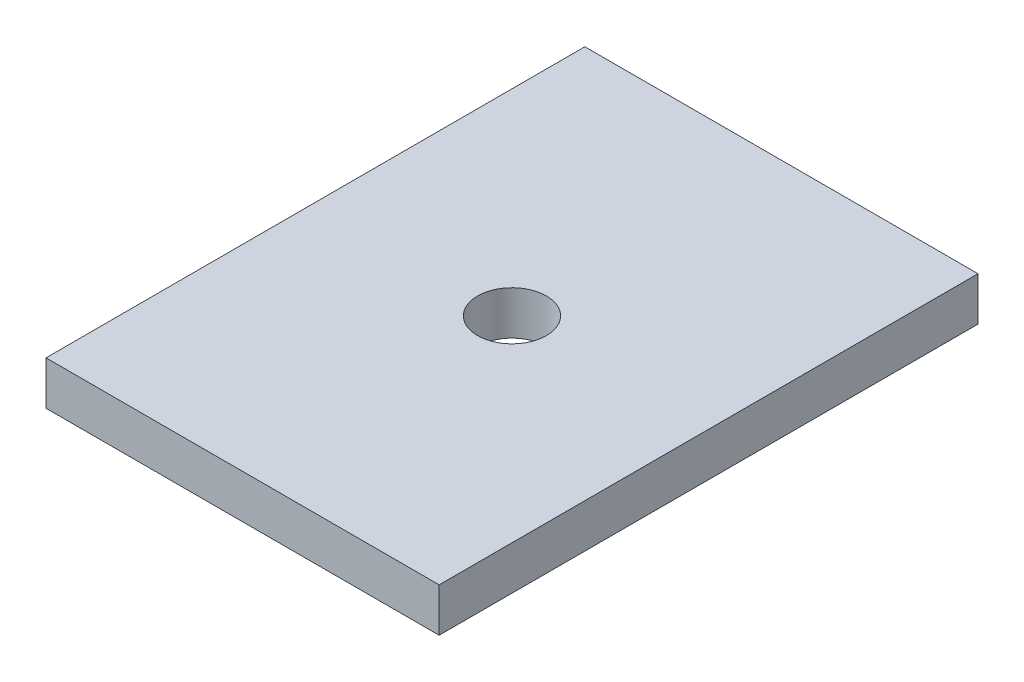
ISO-10303-21;
HEADER;
FILE_DESCRIPTION(('STEP AP214'),'2;1');
FILE_NAME('part.step','',(''),(''),'','','');
FILE_SCHEMA(('AUTOMOTIVE_DESIGN { 1 0 10303 214 1 1 1 1 }'));
ENDSEC;
DATA;
#1=APPLICATION_CONTEXT('core data for automotive mechanical design processes');
#2=APPLICATION_PROTOCOL_DEFINITION('international standard','automotive_design',2000,#1);
#3=PRODUCT_CONTEXT('',#1,'mechanical');
#4=PRODUCT('Part','Part','',(#3));
#5=PRODUCT_RELATED_PRODUCT_CATEGORY('part','',(#4));
#6=PRODUCT_DEFINITION_FORMATION('','',#4);
#7=PRODUCT_DEFINITION_CONTEXT('part definition',#1,'design');
#8=PRODUCT_DEFINITION('design','',#6,#7);
#9=PRODUCT_DEFINITION_SHAPE('','',#8);
#10=(LENGTH_UNIT() NAMED_UNIT(*) SI_UNIT(.MILLI.,.METRE.));
#11=(NAMED_UNIT(*) PLANE_ANGLE_UNIT() SI_UNIT($,.RADIAN.));
#12=(NAMED_UNIT(*) SI_UNIT($,.STERADIAN.) SOLID_ANGLE_UNIT());
#13=UNCERTAINTY_MEASURE_WITH_UNIT(LENGTH_MEASURE(1.E-05),#10,'distance_accuracy_value','');
#14=(GEOMETRIC_REPRESENTATION_CONTEXT(3) GLOBAL_UNCERTAINTY_ASSIGNED_CONTEXT((#13)) GLOBAL_UNIT_ASSIGNED_CONTEXT((#10,
#11,#12)) REPRESENTATION_CONTEXT('',''));
#15=CARTESIAN_POINT('',(0.,0.,0.));
#16=DIRECTION('',(0.,0.,1.));
#17=DIRECTION('',(1.,0.,0.));
#18=AXIS2_PLACEMENT_3D('',#15,#16,#17);
#19=CARTESIAN_POINT('',(0.,19.05,0.));
#20=DIRECTION('',(0.,-1.,0.));
#21=DIRECTION('',(0.,0.,-1.));
#22=AXIS2_PLACEMENT_3D('',#19,#20,#21);
#23=PLANE('',#22);
#24=DIRECTION('',(0.,0.,-1.));
#25=VECTOR('',#24,1.);
#26=CARTESIAN_POINT('',(85.725,19.05,117.5));
#27=LINE('',#26,#25);
#28=CARTESIAN_POINT('',(85.725,19.05,117.5));
#29=VERTEX_POINT('',#28);
#30=CARTESIAN_POINT('',(85.725,19.05,-117.5));
#31=VERTEX_POINT('',#30);
#32=EDGE_CURVE('E86',#29,#31,#27,.T.);
#33=ORIENTED_EDGE('',*,*,#32,.T.);
#34=DIRECTION('',(-1.,0.,0.));
#35=VECTOR('',#34,1.);
#36=CARTESIAN_POINT('',(-85.725,19.05,-117.5));
#37=LINE('',#36,#35);
#38=CARTESIAN_POINT('',(-85.725,19.05,-117.5));
#39=VERTEX_POINT('',#38);
#40=EDGE_CURVE('E81',#31,#39,#37,.T.);
#41=ORIENTED_EDGE('',*,*,#40,.T.);
#42=DIRECTION('',(0.,0.,1.));
#43=VECTOR('',#42,1.);
#44=CARTESIAN_POINT('',(-85.725,19.05,117.5));
#45=LINE('',#44,#43);
#46=CARTESIAN_POINT('',(-85.725,19.05,117.5));
#47=VERTEX_POINT('',#46);
#48=EDGE_CURVE('E84',#39,#47,#45,.T.);
#49=ORIENTED_EDGE('',*,*,#48,.T.);
#50=DIRECTION('',(1.,0.,0.));
#51=VECTOR('',#50,1.);
#52=CARTESIAN_POINT('',(-85.725,19.05,117.5));
#53=LINE('',#52,#51);
#54=EDGE_CURVE('E51',#47,#29,#53,.T.);
#55=ORIENTED_EDGE('',*,*,#54,.T.);
#56=EDGE_LOOP('',(#33,#41,#49,#55));
#57=FACE_BOUND('',#56,.T.);
#58=CARTESIAN_POINT('',(0.,19.05,0.));
#59=DIRECTION('',(0.,1.,0.));
#60=DIRECTION('',(0.,0.,1.));
#61=AXIS2_PLACEMENT_3D('',#58,#59,#60);
#62=CIRCLE('',#61,15.);
#63=CARTESIAN_POINT('',(0.,19.05,-15.));
#64=VERTEX_POINT('',#63);
#65=EDGE_CURVE('E101',#64,#64,#62,.T.);
#66=ORIENTED_EDGE('',*,*,#65,.F.);
#67=EDGE_LOOP('',(#66));
#68=FACE_BOUND('',#67,.T.);
#69=ADVANCED_FACE('F34',(#57,#68),#23,.F.);
#70=CARTESIAN_POINT('',(0.,0.,0.));
#71=DIRECTION('',(0.,-1.,0.));
#72=DIRECTION('',(0.,0.,-1.));
#73=AXIS2_PLACEMENT_3D('',#70,#71,#72);
#74=PLANE('',#73);
#75=DIRECTION('',(0.,0.,-1.));
#76=VECTOR('',#75,1.);
#77=CARTESIAN_POINT('',(85.725,0.,117.5));
#78=LINE('',#77,#76);
#79=CARTESIAN_POINT('',(85.725,0.,117.5));
#80=VERTEX_POINT('',#79);
#81=CARTESIAN_POINT('',(85.725,0.,-117.5));
#82=VERTEX_POINT('',#81);
#83=EDGE_CURVE('E98',#80,#82,#78,.T.);
#84=ORIENTED_EDGE('',*,*,#83,.F.);
#85=DIRECTION('',(1.,0.,0.));
#86=VECTOR('',#85,1.);
#87=CARTESIAN_POINT('',(-85.725,0.,117.5));
#88=LINE('',#87,#86);
#89=CARTESIAN_POINT('',(-85.725,0.,117.5));
#90=VERTEX_POINT('',#89);
#91=EDGE_CURVE('E74',#90,#80,#88,.T.);
#92=ORIENTED_EDGE('',*,*,#91,.F.);
#93=DIRECTION('',(0.,0.,1.));
#94=VECTOR('',#93,1.);
#95=CARTESIAN_POINT('',(-85.725,0.,117.5));
#96=LINE('',#95,#94);
#97=CARTESIAN_POINT('',(-85.725,0.,-117.5));
#98=VERTEX_POINT('',#97);
#99=EDGE_CURVE('E68',#98,#90,#96,.T.);
#100=ORIENTED_EDGE('',*,*,#99,.F.);
#101=DIRECTION('',(-1.,0.,0.));
#102=VECTOR('',#101,1.);
#103=CARTESIAN_POINT('',(-85.725,0.,-117.5));
#104=LINE('',#103,#102);
#105=EDGE_CURVE('E90',#82,#98,#104,.T.);
#106=ORIENTED_EDGE('',*,*,#105,.F.);
#107=EDGE_LOOP('',(#84,#92,#100,#106));
#108=FACE_BOUND('',#107,.T.);
#109=CARTESIAN_POINT('',(0.,0.,0.));
#110=DIRECTION('',(0.,1.,0.));
#111=DIRECTION('',(0.,0.,1.));
#112=AXIS2_PLACEMENT_3D('',#109,#110,#111);
#113=CIRCLE('',#112,15.);
#114=CARTESIAN_POINT('',(0.,0.,-15.));
#115=VERTEX_POINT('',#114);
#116=EDGE_CURVE('E113',#115,#115,#113,.T.);
#117=ORIENTED_EDGE('',*,*,#116,.T.);
#118=EDGE_LOOP('',(#117));
#119=FACE_BOUND('',#118,.T.);
#120=ADVANCED_FACE('F109',(#108,#119),#74,.T.);
#121=CARTESIAN_POINT('',(85.725,19.05,117.5));
#122=DIRECTION('',(-1.,0.,0.));
#123=DIRECTION('',(0.,0.,1.));
#124=AXIS2_PLACEMENT_3D('',#121,#122,#123);
#125=PLANE('',#124);
#126=ORIENTED_EDGE('',*,*,#83,.T.);
#127=DIRECTION('',(0.,-1.,0.));
#128=VECTOR('',#127,1.);
#129=CARTESIAN_POINT('',(85.725,19.05,-117.5));
#130=LINE('',#129,#128);
#131=EDGE_CURVE('E11',#31,#82,#130,.T.);
#132=ORIENTED_EDGE('',*,*,#131,.F.);
#133=ORIENTED_EDGE('',*,*,#32,.F.);
#134=DIRECTION('',(0.,-1.,0.));
#135=VECTOR('',#134,1.);
#136=CARTESIAN_POINT('',(85.725,19.05,117.5));
#137=LINE('',#136,#135);
#138=EDGE_CURVE('E94',#29,#80,#137,.T.);
#139=ORIENTED_EDGE('',*,*,#138,.T.);
#140=EDGE_LOOP('',(#126,#132,#133,#139));
#141=FACE_BOUND('',#140,.T.);
#142=ADVANCED_FACE('F36',(#141),#125,.F.);
#143=CARTESIAN_POINT('',(-85.725,19.05,-117.5));
#144=DIRECTION('',(0.,0.,1.));
#145=DIRECTION('',(1.,0.,0.));
#146=AXIS2_PLACEMENT_3D('',#143,#144,#145);
#147=PLANE('',#146);
#148=ORIENTED_EDGE('',*,*,#105,.T.);
#149=DIRECTION('',(0.,-1.,0.));
#150=VECTOR('',#149,1.);
#151=CARTESIAN_POINT('',(-85.725,19.05,-117.5));
#152=LINE('',#151,#150);
#153=EDGE_CURVE('E43',#39,#98,#152,.T.);
#154=ORIENTED_EDGE('',*,*,#153,.F.);
#155=ORIENTED_EDGE('',*,*,#40,.F.);
#156=ORIENTED_EDGE('',*,*,#131,.T.);
#157=EDGE_LOOP('',(#148,#154,#155,#156));
#158=FACE_BOUND('',#157,.T.);
#159=ADVANCED_FACE('F89',(#158),#147,.F.);
#160=CARTESIAN_POINT('',(-85.725,19.05,117.5));
#161=DIRECTION('',(1.,0.,0.));
#162=DIRECTION('',(0.,0.,-1.));
#163=AXIS2_PLACEMENT_3D('',#160,#161,#162);
#164=PLANE('',#163);
#165=ORIENTED_EDGE('',*,*,#99,.T.);
#166=DIRECTION('',(0.,-1.,0.));
#167=VECTOR('',#166,1.);
#168=CARTESIAN_POINT('',(-85.725,19.05,117.5));
#169=LINE('',#168,#167);
#170=EDGE_CURVE('E91',#47,#90,#169,.T.);
#171=ORIENTED_EDGE('',*,*,#170,.F.);
#172=ORIENTED_EDGE('',*,*,#48,.F.);
#173=ORIENTED_EDGE('',*,*,#153,.T.);
#174=EDGE_LOOP('',(#165,#171,#172,#173));
#175=FACE_BOUND('',#174,.T.);
#176=ADVANCED_FACE('F92',(#175),#164,.F.);
#177=CARTESIAN_POINT('',(-85.725,19.05,117.5));
#178=DIRECTION('',(0.,0.,-1.));
#179=DIRECTION('',(-1.,0.,0.));
#180=AXIS2_PLACEMENT_3D('',#177,#178,#179);
#181=PLANE('',#180);
#182=ORIENTED_EDGE('',*,*,#91,.T.);
#183=ORIENTED_EDGE('',*,*,#138,.F.);
#184=ORIENTED_EDGE('',*,*,#54,.F.);
#185=ORIENTED_EDGE('',*,*,#170,.T.);
#186=EDGE_LOOP('',(#182,#183,#184,#185));
#187=FACE_BOUND('',#186,.T.);
#188=ADVANCED_FACE('F106',(#187),#181,.F.);
#189=CARTESIAN_POINT('',(0.,19.05,0.));
#190=DIRECTION('',(0.,-1.,0.));
#191=DIRECTION('',(0.,0.,-1.));
#192=AXIS2_PLACEMENT_3D('',#189,#190,#191);
#193=CYLINDRICAL_SURFACE('',#192,15.);
#194=CARTESIAN_POINT('',(0.,19.05,-15.));
#195=CARTESIAN_POINT('',(0.,18.8515625,-15.));
#196=CARTESIAN_POINT('',(0.,18.653125,-15.));
#197=CARTESIAN_POINT('',(0.,18.25625,-15.));
#198=CARTESIAN_POINT('',(0.,18.0578125,-15.));
#199=CARTESIAN_POINT('',(0.,17.6609375,-15.));
#200=CARTESIAN_POINT('',(0.,17.4625,-15.));
#201=CARTESIAN_POINT('',(0.,17.065625,-15.));
#202=CARTESIAN_POINT('',(0.,16.8671875,-15.));
#203=CARTESIAN_POINT('',(0.,16.4703125,-15.));
#204=CARTESIAN_POINT('',(0.,16.271875,-15.));
#205=CARTESIAN_POINT('',(0.,15.875,-15.));
#206=CARTESIAN_POINT('',(0.,15.6765625,-15.));
#207=CARTESIAN_POINT('',(0.,15.2796875,-15.));
#208=CARTESIAN_POINT('',(0.,15.08125,-15.));
#209=CARTESIAN_POINT('',(0.,14.684375,-15.));
#210=CARTESIAN_POINT('',(0.,14.4859375,-15.));
#211=CARTESIAN_POINT('',(0.,14.0890625,-15.));
#212=CARTESIAN_POINT('',(0.,13.890625,-15.));
#213=CARTESIAN_POINT('',(0.,13.49375,-15.));
#214=CARTESIAN_POINT('',(0.,13.2953125,-15.));
#215=CARTESIAN_POINT('',(0.,12.8984375,-15.));
#216=CARTESIAN_POINT('',(0.,12.7,-15.));
#217=CARTESIAN_POINT('',(0.,12.303125,-15.));
#218=CARTESIAN_POINT('',(0.,12.1046875,-15.));
#219=CARTESIAN_POINT('',(0.,11.7078125,-15.));
#220=CARTESIAN_POINT('',(0.,11.509375,-15.));
#221=CARTESIAN_POINT('',(0.,11.1125,-15.));
#222=CARTESIAN_POINT('',(0.,10.9140625,-15.));
#223=CARTESIAN_POINT('',(0.,10.5171875,-15.));
#224=CARTESIAN_POINT('',(0.,10.31875,-15.));
#225=CARTESIAN_POINT('',(0.,9.921875,-15.));
#226=CARTESIAN_POINT('',(0.,9.7234375,-15.));
#227=CARTESIAN_POINT('',(0.,9.3265625,-15.));
#228=CARTESIAN_POINT('',(0.,9.128125,-15.));
#229=CARTESIAN_POINT('',(0.,8.73125,-15.));
#230=CARTESIAN_POINT('',(0.,8.5328125,-15.));
#231=CARTESIAN_POINT('',(0.,8.1359375,-15.));
#232=CARTESIAN_POINT('',(0.,7.9375,-15.));
#233=CARTESIAN_POINT('',(0.,7.540625,-15.));
#234=CARTESIAN_POINT('',(0.,7.3421875,-15.));
#235=CARTESIAN_POINT('',(0.,6.9453125,-15.));
#236=CARTESIAN_POINT('',(0.,6.746875,-15.));
#237=CARTESIAN_POINT('',(0.,6.35,-15.));
#238=CARTESIAN_POINT('',(0.,6.1515625,-15.));
#239=CARTESIAN_POINT('',(0.,5.7546875,-15.));
#240=CARTESIAN_POINT('',(0.,5.55625,-15.));
#241=CARTESIAN_POINT('',(0.,5.159375,-15.));
#242=CARTESIAN_POINT('',(0.,4.9609375,-15.));
#243=CARTESIAN_POINT('',(0.,4.5640625,-15.));
#244=CARTESIAN_POINT('',(0.,4.365625,-15.));
#245=CARTESIAN_POINT('',(0.,3.96875,-15.));
#246=CARTESIAN_POINT('',(0.,3.7703125,-15.));
#247=CARTESIAN_POINT('',(0.,3.3734375,-15.));
#248=CARTESIAN_POINT('',(0.,3.175,-15.));
#249=CARTESIAN_POINT('',(0.,2.778125,-15.));
#250=CARTESIAN_POINT('',(0.,2.5796875,-15.));
#251=CARTESIAN_POINT('',(0.,2.1828125,-15.));
#252=CARTESIAN_POINT('',(0.,1.984375,-15.));
#253=CARTESIAN_POINT('',(0.,1.5875,-15.));
#254=CARTESIAN_POINT('',(0.,1.3890625,-15.));
#255=CARTESIAN_POINT('',(0.,0.992187500000001,-15.));
#256=CARTESIAN_POINT('',(0.,0.793750000000001,-15.));
#257=CARTESIAN_POINT('',(0.,0.396875,-15.));
#258=CARTESIAN_POINT('',(0.,0.1984375,-15.));
#259=CARTESIAN_POINT('',(0.,0.,-15.));
#260=B_SPLINE_CURVE_WITH_KNOTS('',3,(#194,#195,#196,#197,#198,#199,#200,#201,#202,#203,#204,
#205,#206,#207,#208,#209,#210,#211,#212,#213,#214,#215,#216,#217,#218,#219,#220,#221,#222,#223,
#224,#225,#226,#227,#228,#229,#230,#231,#232,#233,#234,#235,#236,#237,#238,#239,#240,#241,#242,
#243,#244,#245,#246,#247,#248,#249,#250,#251,#252,#253,#254,#255,#256,#257,#258,#259),
.UNSPECIFIED.,.F.,.F.,(4,2,2,2,2,2,2,2,2,2,2,2,2,2,2,2,2,2,2,2,2,2,2,2,2,2,2,2,2,2,2,2,4),(0.,
0.5953125,1.190625,1.7859375,2.38125,2.9765625,3.571875,4.1671875,4.7625,5.3578125,5.953125,
6.5484375,7.14375,7.7390625,8.334375,8.9296875,9.525,10.1203125,10.715625,11.3109375,11.90625,
12.5015625,13.096875,13.6921875,14.2875,14.8828125,15.478125,16.0734375,16.66875,17.2640625,
17.859375,18.4546875,19.05),.UNSPECIFIED.);
#261=EDGE_CURVE('BSEAM119',#64,#115,#260,.T.);
#262=ORIENTED_EDGE('',*,*,#65,.T.);
#263=ORIENTED_EDGE('',*,*,#116,.F.);
#264=ORIENTED_EDGE('',*,*,#261,.T.);
#265=ORIENTED_EDGE('',*,*,#261,.F.);
#266=EDGE_LOOP('',(#262,#264,#263,#265));
#267=FACE_BOUND('',#266,.T.);
#268=ADVANCED_FACE('F119',(#267),#193,.F.);
#269=CLOSED_SHELL('',(#69,#120,#142,#159,#176,#188,#268));
#270=MANIFOLD_SOLID_BREP('B2',#269);
#271=ADVANCED_BREP_SHAPE_REPRESENTATION('',(#18,#270),#14);
#272=SHAPE_DEFINITION_REPRESENTATION(#9,#271);
ENDSEC;
END-ISO-10303-21;
